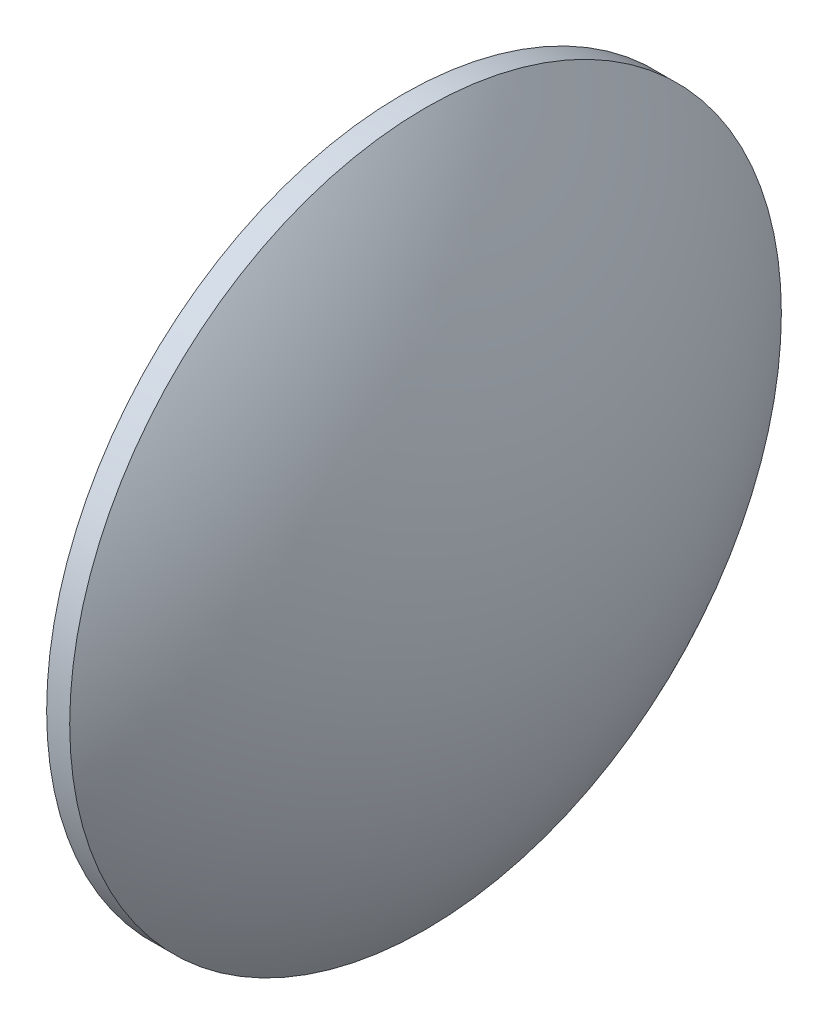
ISO-10303-21;
HEADER;
FILE_DESCRIPTION(('STEP AP214'),'2;1');
FILE_NAME('part.step','',(''),(''),'','','');
FILE_SCHEMA(('AUTOMOTIVE_DESIGN { 1 0 10303 214 1 1 1 1 }'));
ENDSEC;
DATA;
#1=APPLICATION_CONTEXT('core data for automotive mechanical design processes');
#2=APPLICATION_PROTOCOL_DEFINITION('international standard','automotive_design',2000,#1);
#3=PRODUCT_CONTEXT('',#1,'mechanical');
#4=PRODUCT('Part','Part','',(#3));
#5=PRODUCT_RELATED_PRODUCT_CATEGORY('part','',(#4));
#6=PRODUCT_DEFINITION_FORMATION('','',#4);
#7=PRODUCT_DEFINITION_CONTEXT('part definition',#1,'design');
#8=PRODUCT_DEFINITION('design','',#6,#7);
#9=PRODUCT_DEFINITION_SHAPE('','',#8);
#10=(LENGTH_UNIT() NAMED_UNIT(*) SI_UNIT(.MILLI.,.METRE.));
#11=(NAMED_UNIT(*) PLANE_ANGLE_UNIT() SI_UNIT($,.RADIAN.));
#12=(NAMED_UNIT(*) SI_UNIT($,.STERADIAN.) SOLID_ANGLE_UNIT());
#13=UNCERTAINTY_MEASURE_WITH_UNIT(LENGTH_MEASURE(1.E-05),#10,'distance_accuracy_value','');
#14=(GEOMETRIC_REPRESENTATION_CONTEXT(3) GLOBAL_UNCERTAINTY_ASSIGNED_CONTEXT((#13)) GLOBAL_UNIT_ASSIGNED_CONTEXT((#10,
#11,#12)) REPRESENTATION_CONTEXT('',''));
#15=CARTESIAN_POINT('',(0.,0.,0.));
#16=DIRECTION('',(0.,0.,1.));
#17=DIRECTION('',(1.,0.,0.));
#18=AXIS2_PLACEMENT_3D('',#15,#16,#17);
#19=CARTESIAN_POINT('',(2.,0.,0.));
#20=DIRECTION('',(-1.,0.,0.));
#21=DIRECTION('',(0.,0.,1.));
#22=AXIS2_PLACEMENT_3D('',#19,#20,#21);
#23=CYLINDRICAL_SURFACE('',#22,30.8511391475274);
#24=CARTESIAN_POINT('',(2.,0.,0.));
#25=DIRECTION('',(1.,0.,0.));
#26=DIRECTION('',(0.,0.,-1.));
#27=AXIS2_PLACEMENT_3D('',#24,#25,#26);
#28=CIRCLE('',#27,30.8511391475274);
#29=CARTESIAN_POINT('',(2.,0.,-30.8511391475274));
#30=VERTEX_POINT('',#29);
#31=EDGE_CURVE('E10',#30,#30,#28,.T.);
#32=ORIENTED_EDGE('',*,*,#31,.F.);
#33=EDGE_LOOP('',(#32));
#34=FACE_BOUND('',#33,.T.);
#35=CARTESIAN_POINT('',(0.,0.,0.));
#36=DIRECTION('',(1.,0.,0.));
#37=DIRECTION('',(0.,0.,-1.));
#38=AXIS2_PLACEMENT_3D('',#35,#36,#37);
#39=CIRCLE('',#38,30.8511391475274);
#40=CARTESIAN_POINT('',(0.,0.,-30.8511391475274));
#41=VERTEX_POINT('',#40);
#42=EDGE_CURVE('E37',#41,#41,#39,.T.);
#43=ORIENTED_EDGE('',*,*,#42,.T.);
#44=EDGE_LOOP('',(#43));
#45=FACE_BOUND('',#44,.T.);
#46=ADVANCED_FACE('F33',(#34,#45),#23,.T.);
#47=CARTESIAN_POINT('',(-40.589639335005,0.,0.));
#48=DIRECTION('',(0.,0.,1.));
#49=DIRECTION('',(1.,0.,0.));
#50=AXIS2_PLACEMENT_3D('',#47,#48,#49);
#51=SPHERICAL_SURFACE('',#50,52.589639335005);
#52=CARTESIAN_POINT('',(-40.589639335005,0.,0.));
#53=DIRECTION('',(1.,0.,0.));
#54=DIRECTION('',(0.,0.,-1.));
#55=AXIS2_PLACEMENT_3D('',#52,#53,#54);
#56=SPHERICAL_SURFACE('',#55,52.589639335005);
#57=ORIENTED_EDGE('',*,*,#31,.T.);
#58=EDGE_LOOP('',(#57));
#59=FACE_BOUND('',#58,.T.);
#60=ADVANCED_FACE('F48',(#59),#56,.T.);
#61=CARTESIAN_POINT('',(42.589639335005,0.,0.));
#62=DIRECTION('',(0.,0.,1.));
#63=DIRECTION('',(1.,0.,0.));
#64=AXIS2_PLACEMENT_3D('',#61,#62,#63);
#65=SPHERICAL_SURFACE('',#64,52.589639335005);
#66=CARTESIAN_POINT('',(42.589639335005,0.,0.));
#67=DIRECTION('',(1.,0.,0.));
#68=DIRECTION('',(0.,0.,-1.));
#69=AXIS2_PLACEMENT_3D('',#66,#67,#68);
#70=SPHERICAL_SURFACE('',#69,52.589639335005);
#71=ORIENTED_EDGE('',*,*,#42,.F.);
#72=EDGE_LOOP('',(#71));
#73=FACE_BOUND('',#72,.T.);
#74=ADVANCED_FACE('F35',(#73),#70,.T.);
#75=CLOSED_SHELL('',(#46,#60,#74));
#76=MANIFOLD_SOLID_BREP('B2',#75);
#77=ADVANCED_BREP_SHAPE_REPRESENTATION('',(#18,#76),#14);
#78=SHAPE_DEFINITION_REPRESENTATION(#9,#77);
ENDSEC;
END-ISO-10303-21;
